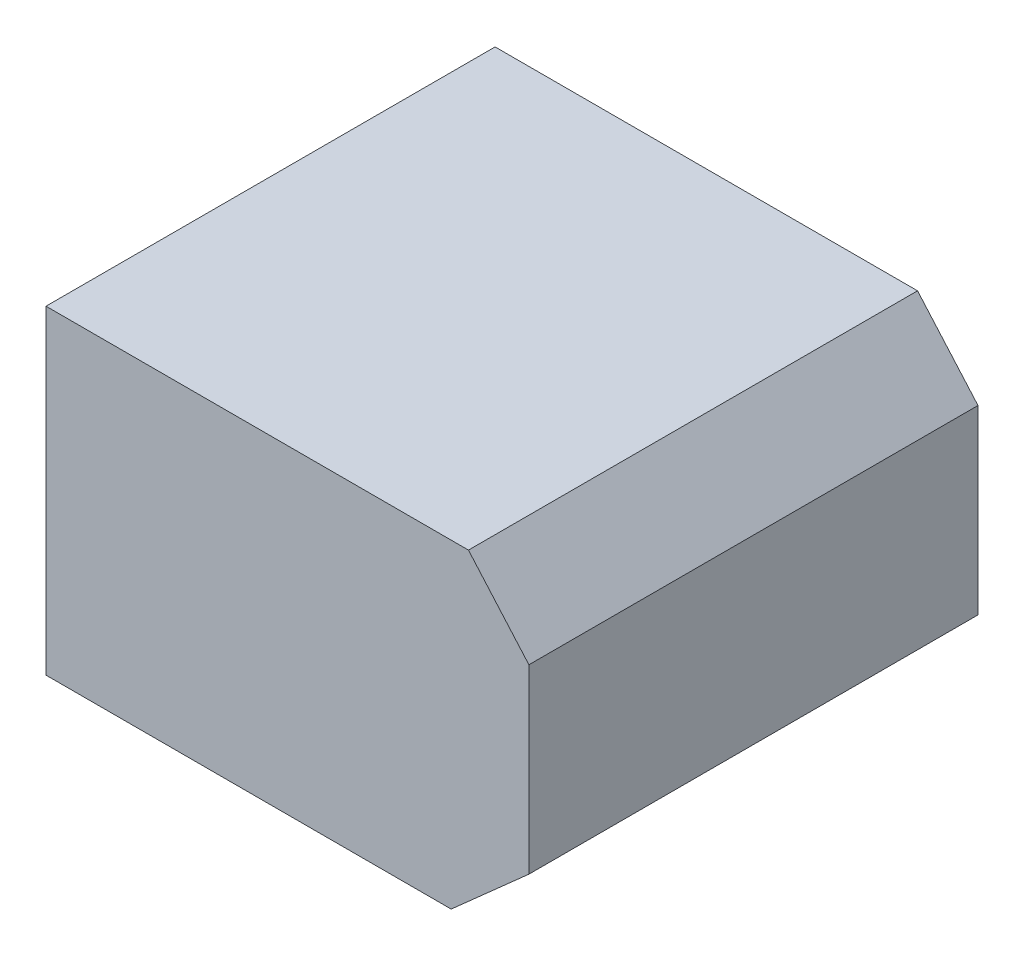
ISO-10303-21;
HEADER;
FILE_DESCRIPTION(('STEP AP214'),'2;1');
FILE_NAME('part.step','',(''),(''),'','','');
FILE_SCHEMA(('AUTOMOTIVE_DESIGN { 1 0 10303 214 1 1 1 1 }'));
ENDSEC;
DATA;
#1=APPLICATION_CONTEXT('core data for automotive mechanical design processes');
#2=APPLICATION_PROTOCOL_DEFINITION('international standard','automotive_design',2000,#1);
#3=PRODUCT_CONTEXT('',#1,'mechanical');
#4=PRODUCT('Part','Part','',(#3));
#5=PRODUCT_RELATED_PRODUCT_CATEGORY('part','',(#4));
#6=PRODUCT_DEFINITION_FORMATION('','',#4);
#7=PRODUCT_DEFINITION_CONTEXT('part definition',#1,'design');
#8=PRODUCT_DEFINITION('design','',#6,#7);
#9=PRODUCT_DEFINITION_SHAPE('','',#8);
#10=(LENGTH_UNIT() NAMED_UNIT(*) SI_UNIT(.MILLI.,.METRE.));
#11=(NAMED_UNIT(*) PLANE_ANGLE_UNIT() SI_UNIT($,.RADIAN.));
#12=(NAMED_UNIT(*) SI_UNIT($,.STERADIAN.) SOLID_ANGLE_UNIT());
#13=UNCERTAINTY_MEASURE_WITH_UNIT(LENGTH_MEASURE(1.E-05),#10,'distance_accuracy_value','');
#14=(GEOMETRIC_REPRESENTATION_CONTEXT(3) GLOBAL_UNCERTAINTY_ASSIGNED_CONTEXT((#13)) GLOBAL_UNIT_ASSIGNED_CONTEXT((#10,
#11,#12)) REPRESENTATION_CONTEXT('',''));
#15=CARTESIAN_POINT('',(0.,0.,0.));
#16=DIRECTION('',(0.,0.,1.));
#17=DIRECTION('',(1.,0.,0.));
#18=AXIS2_PLACEMENT_3D('',#15,#16,#17);
#19=CARTESIAN_POINT('',(-0.915165952785248,-37.,52.));
#20=DIRECTION('',(1.,0.,0.));
#21=DIRECTION('',(0.,0.,-1.));
#22=AXIS2_PLACEMENT_3D('',#19,#20,#21);
#23=PLANE('',#22);
#24=DIRECTION('',(0.,-1.,0.));
#25=VECTOR('',#24,1.);
#26=CARTESIAN_POINT('',(-0.915165952785248,-37.,0.));
#27=LINE('',#26,#25);
#28=CARTESIAN_POINT('',(-0.915165952785248,0.,0.));
#29=VERTEX_POINT('',#28);
#30=CARTESIAN_POINT('',(-0.915165952785248,-37.,0.));
#31=VERTEX_POINT('',#30);
#32=EDGE_CURVE('E135',#29,#31,#27,.T.);
#33=ORIENTED_EDGE('',*,*,#32,.T.);
#34=DIRECTION('',(0.,0.,-1.));
#35=VECTOR('',#34,1.);
#36=CARTESIAN_POINT('',(-0.915165952785248,-37.,52.));
#37=LINE('',#36,#35);
#38=CARTESIAN_POINT('',(-0.915165952785248,-37.,52.));
#39=VERTEX_POINT('',#38);
#40=EDGE_CURVE('E11',#39,#31,#37,.T.);
#41=ORIENTED_EDGE('',*,*,#40,.F.);
#42=DIRECTION('',(0.,-1.,0.));
#43=VECTOR('',#42,1.);
#44=CARTESIAN_POINT('',(-0.915165952785248,-37.,52.));
#45=LINE('',#44,#43);
#46=CARTESIAN_POINT('',(-0.915165952785248,0.,52.));
#47=VERTEX_POINT('',#46);
#48=EDGE_CURVE('E147',#47,#39,#45,.T.);
#49=ORIENTED_EDGE('',*,*,#48,.F.);
#50=DIRECTION('',(0.,0.,-1.));
#51=VECTOR('',#50,1.);
#52=CARTESIAN_POINT('',(-0.915165952785248,0.,52.));
#53=LINE('',#52,#51);
#54=EDGE_CURVE('E131',#47,#29,#53,.T.);
#55=ORIENTED_EDGE('',*,*,#54,.T.);
#56=EDGE_LOOP('',(#33,#41,#49,#55));
#57=FACE_BOUND('',#56,.T.);
#58=DIRECTION('',(0.,-1.,0.));
#59=VECTOR('',#58,1.);
#60=CARTESIAN_POINT('',(-0.915165952785248,0.,5.));
#61=LINE('',#60,#59);
#62=CARTESIAN_POINT('',(-0.915165952785248,-5.,5.));
#63=VERTEX_POINT('',#62);
#64=CARTESIAN_POINT('',(-0.915165952785248,-32.,5.));
#65=VERTEX_POINT('',#64);
#66=EDGE_CURVE('E165',#63,#65,#61,.T.);
#67=ORIENTED_EDGE('',*,*,#66,.F.);
#68=DIRECTION('',(0.,0.,-1.));
#69=VECTOR('',#68,1.);
#70=CARTESIAN_POINT('',(-0.915165952785248,-5.,52.));
#71=LINE('',#70,#69);
#72=CARTESIAN_POINT('',(-0.915165952785248,-5.,47.));
#73=VERTEX_POINT('',#72);
#74=EDGE_CURVE('E169',#73,#63,#71,.T.);
#75=ORIENTED_EDGE('',*,*,#74,.F.);
#76=DIRECTION('',(0.,-1.,0.));
#77=VECTOR('',#76,1.);
#78=CARTESIAN_POINT('',(-0.915165952785248,0.,47.));
#79=LINE('',#78,#77);
#80=CARTESIAN_POINT('',(-0.915165952785248,-32.,47.));
#81=VERTEX_POINT('',#80);
#82=EDGE_CURVE('E53',#73,#81,#79,.T.);
#83=ORIENTED_EDGE('',*,*,#82,.T.);
#84=DIRECTION('',(0.,0.,-1.));
#85=VECTOR('',#84,1.);
#86=CARTESIAN_POINT('',(-0.915165952785249,-32.,52.));
#87=LINE('',#86,#85);
#88=EDGE_CURVE('E139',#81,#65,#87,.T.);
#89=ORIENTED_EDGE('',*,*,#88,.T.);
#90=EDGE_LOOP('',(#67,#75,#83,#89));
#91=FACE_BOUND('',#90,.T.);
#92=ADVANCED_FACE('F39',(#57,#91),#23,.F.);
#93=CARTESIAN_POINT('',(46.,-37.,52.));
#94=DIRECTION('',(0.,1.,0.));
#95=DIRECTION('',(0.,0.,1.));
#96=AXIS2_PLACEMENT_3D('',#93,#94,#95);
#97=PLANE('',#96);
#98=DIRECTION('',(1.,0.,0.));
#99=VECTOR('',#98,1.);
#100=CARTESIAN_POINT('',(46.,-37.,0.));
#101=LINE('',#100,#99);
#102=CARTESIAN_POINT('',(46.,-37.,0.));
#103=VERTEX_POINT('',#102);
#104=EDGE_CURVE('E138',#31,#103,#101,.T.);
#105=ORIENTED_EDGE('',*,*,#104,.T.);
#106=DIRECTION('',(0.,0.,-1.));
#107=VECTOR('',#106,1.);
#108=CARTESIAN_POINT('',(46.,-37.,52.));
#109=LINE('',#108,#107);
#110=CARTESIAN_POINT('',(46.,-37.,52.));
#111=VERTEX_POINT('',#110);
#112=EDGE_CURVE('E46',#111,#103,#109,.T.);
#113=ORIENTED_EDGE('',*,*,#112,.F.);
#114=DIRECTION('',(1.,0.,0.));
#115=VECTOR('',#114,1.);
#116=CARTESIAN_POINT('',(46.,-37.,52.));
#117=LINE('',#116,#115);
#118=EDGE_CURVE('E97',#39,#111,#117,.T.);
#119=ORIENTED_EDGE('',*,*,#118,.F.);
#120=ORIENTED_EDGE('',*,*,#40,.T.);
#121=EDGE_LOOP('',(#105,#113,#119,#120));
#122=FACE_BOUND('',#121,.T.);
#123=ADVANCED_FACE('F256',(#122),#97,.F.);
#124=CARTESIAN_POINT('',(55.,-29.,52.));
#125=DIRECTION('',(-0.66436383882992,0.74740931868366,0.));
#126=DIRECTION('',(-0.74740931868366,-0.66436383882992,0.));
#127=AXIS2_PLACEMENT_3D('',#124,#125,#126);
#128=PLANE('',#127);
#129=DIRECTION('',(0.74740931868366,0.66436383882992,0.));
#130=VECTOR('',#129,1.);
#131=CARTESIAN_POINT('',(55.,-29.,0.));
#132=LINE('',#131,#130);
#133=CARTESIAN_POINT('',(55.,-29.,0.));
#134=VERTEX_POINT('',#133);
#135=EDGE_CURVE('E141',#103,#134,#132,.T.);
#136=ORIENTED_EDGE('',*,*,#135,.T.);
#137=DIRECTION('',(0.,0.,-1.));
#138=VECTOR('',#137,1.);
#139=CARTESIAN_POINT('',(55.,-29.,52.));
#140=LINE('',#139,#138);
#141=CARTESIAN_POINT('',(55.,-29.,52.));
#142=VERTEX_POINT('',#141);
#143=EDGE_CURVE('E126',#142,#134,#140,.T.);
#144=ORIENTED_EDGE('',*,*,#143,.F.);
#145=DIRECTION('',(0.74740931868366,0.66436383882992,0.));
#146=VECTOR('',#145,1.);
#147=CARTESIAN_POINT('',(55.,-29.,52.));
#148=LINE('',#147,#146);
#149=EDGE_CURVE('E114',#111,#142,#148,.T.);
#150=ORIENTED_EDGE('',*,*,#149,.F.);
#151=ORIENTED_EDGE('',*,*,#112,.T.);
#152=EDGE_LOOP('',(#136,#144,#150,#151));
#153=FACE_BOUND('',#152,.T.);
#154=ADVANCED_FACE('F153',(#153),#128,.F.);
#155=CARTESIAN_POINT('',(55.,-8.,52.));
#156=DIRECTION('',(-1.,0.,0.));
#157=DIRECTION('',(0.,0.,1.));
#158=AXIS2_PLACEMENT_3D('',#155,#156,#157);
#159=PLANE('',#158);
#160=DIRECTION('',(0.,1.,0.));
#161=VECTOR('',#160,1.);
#162=CARTESIAN_POINT('',(55.,-8.,0.));
#163=LINE('',#162,#161);
#164=CARTESIAN_POINT('',(55.,-8.,0.));
#165=VERTEX_POINT('',#164);
#166=EDGE_CURVE('E123',#134,#165,#163,.T.);
#167=ORIENTED_EDGE('',*,*,#166,.T.);
#168=DIRECTION('',(0.,0.,-1.));
#169=VECTOR('',#168,1.);
#170=CARTESIAN_POINT('',(55.,-8.,52.));
#171=LINE('',#170,#169);
#172=CARTESIAN_POINT('',(55.,-8.,52.));
#173=VERTEX_POINT('',#172);
#174=EDGE_CURVE('E120',#173,#165,#171,.T.);
#175=ORIENTED_EDGE('',*,*,#174,.F.);
#176=DIRECTION('',(0.,1.,0.));
#177=VECTOR('',#176,1.);
#178=CARTESIAN_POINT('',(55.,-8.,52.));
#179=LINE('',#178,#177);
#180=EDGE_CURVE('E107',#142,#173,#179,.T.);
#181=ORIENTED_EDGE('',*,*,#180,.F.);
#182=ORIENTED_EDGE('',*,*,#143,.T.);
#183=EDGE_LOOP('',(#167,#175,#181,#182));
#184=FACE_BOUND('',#183,.T.);
#185=ADVANCED_FACE('F121',(#184),#159,.F.);
#186=CARTESIAN_POINT('',(48.,0.,52.));
#187=DIRECTION('',(-0.752576694706878,-0.658504607868518,0.));
#188=DIRECTION('',(0.658504607868518,-0.752576694706878,0.));
#189=AXIS2_PLACEMENT_3D('',#186,#187,#188);
#190=PLANE('',#189);
#191=DIRECTION('',(-0.658504607868518,0.752576694706878,0.));
#192=VECTOR('',#191,1.);
#193=CARTESIAN_POINT('',(48.,0.,0.));
#194=LINE('',#193,#192);
#195=CARTESIAN_POINT('',(48.,0.,0.));
#196=VERTEX_POINT('',#195);
#197=EDGE_CURVE('E144',#165,#196,#194,.T.);
#198=ORIENTED_EDGE('',*,*,#197,.T.);
#199=DIRECTION('',(0.,0.,-1.));
#200=VECTOR('',#199,1.);
#201=CARTESIAN_POINT('',(48.,0.,52.));
#202=LINE('',#201,#200);
#203=CARTESIAN_POINT('',(48.,0.,52.));
#204=VERTEX_POINT('',#203);
#205=EDGE_CURVE('E127',#204,#196,#202,.T.);
#206=ORIENTED_EDGE('',*,*,#205,.F.);
#207=DIRECTION('',(-0.658504607868518,0.752576694706878,0.));
#208=VECTOR('',#207,1.);
#209=CARTESIAN_POINT('',(48.,0.,52.));
#210=LINE('',#209,#208);
#211=EDGE_CURVE('E111',#173,#204,#210,.T.);
#212=ORIENTED_EDGE('',*,*,#211,.F.);
#213=ORIENTED_EDGE('',*,*,#174,.T.);
#214=EDGE_LOOP('',(#198,#206,#212,#213));
#215=FACE_BOUND('',#214,.T.);
#216=ADVANCED_FACE('F129',(#215),#190,.F.);
#217=CARTESIAN_POINT('',(-0.915165952785248,0.,52.));
#218=DIRECTION('',(0.,-1.,0.));
#219=DIRECTION('',(0.,0.,-1.));
#220=AXIS2_PLACEMENT_3D('',#217,#218,#219);
#221=PLANE('',#220);
#222=DIRECTION('',(-1.,0.,0.));
#223=VECTOR('',#222,1.);
#224=CARTESIAN_POINT('',(-0.915165952785248,0.,0.));
#225=LINE('',#224,#223);
#226=EDGE_CURVE('E89',#196,#29,#225,.T.);
#227=ORIENTED_EDGE('',*,*,#226,.T.);
#228=ORIENTED_EDGE('',*,*,#54,.F.);
#229=DIRECTION('',(-1.,0.,0.));
#230=VECTOR('',#229,1.);
#231=CARTESIAN_POINT('',(-0.915165952785248,0.,52.));
#232=LINE('',#231,#230);
#233=EDGE_CURVE('E62',#204,#47,#232,.T.);
#234=ORIENTED_EDGE('',*,*,#233,.F.);
#235=ORIENTED_EDGE('',*,*,#205,.T.);
#236=EDGE_LOOP('',(#227,#228,#234,#235));
#237=FACE_BOUND('',#236,.T.);
#238=ADVANCED_FACE('F157',(#237),#221,.F.);
#239=CARTESIAN_POINT('',(0.,0.,52.));
#240=DIRECTION('',(0.,0.,-1.));
#241=DIRECTION('',(-1.,0.,0.));
#242=AXIS2_PLACEMENT_3D('',#239,#240,#241);
#243=PLANE('',#242);
#244=ORIENTED_EDGE('',*,*,#48,.T.);
#245=ORIENTED_EDGE('',*,*,#118,.T.);
#246=ORIENTED_EDGE('',*,*,#149,.T.);
#247=ORIENTED_EDGE('',*,*,#180,.T.);
#248=ORIENTED_EDGE('',*,*,#211,.T.);
#249=ORIENTED_EDGE('',*,*,#233,.T.);
#250=EDGE_LOOP('',(#244,#245,#246,#247,#248,#249));
#251=FACE_BOUND('',#250,.T.);
#252=ADVANCED_FACE('F109',(#251),#243,.F.);
#253=CARTESIAN_POINT('',(0.,0.,0.));
#254=DIRECTION('',(0.,0.,-1.));
#255=DIRECTION('',(-1.,0.,0.));
#256=AXIS2_PLACEMENT_3D('',#253,#254,#255);
#257=PLANE('',#256);
#258=ORIENTED_EDGE('',*,*,#32,.F.);
#259=ORIENTED_EDGE('',*,*,#226,.F.);
#260=ORIENTED_EDGE('',*,*,#197,.F.);
#261=ORIENTED_EDGE('',*,*,#166,.F.);
#262=ORIENTED_EDGE('',*,*,#135,.F.);
#263=ORIENTED_EDGE('',*,*,#104,.F.);
#264=EDGE_LOOP('',(#258,#259,#260,#261,#262,#263));
#265=FACE_BOUND('',#264,.T.);
#266=ADVANCED_FACE('F156',(#265),#257,.T.);
#267=CARTESIAN_POINT('',(46.,-32.,52.));
#268=DIRECTION('',(0.,1.,0.));
#269=DIRECTION('',(0.,0.,1.));
#270=AXIS2_PLACEMENT_3D('',#267,#268,#269);
#271=PLANE('',#270);
#272=DIRECTION('',(1.,0.,0.));
#273=VECTOR('',#272,1.);
#274=CARTESIAN_POINT('',(0.,-32.,5.));
#275=LINE('',#274,#273);
#276=CARTESIAN_POINT('',(44.0990033882548,-32.,5.));
#277=VERTEX_POINT('',#276);
#278=EDGE_CURVE('E168',#65,#277,#275,.T.);
#279=ORIENTED_EDGE('',*,*,#278,.F.);
#280=ORIENTED_EDGE('',*,*,#88,.F.);
#281=DIRECTION('',(1.,0.,0.));
#282=VECTOR('',#281,1.);
#283=CARTESIAN_POINT('',(0.,-32.,47.));
#284=LINE('',#283,#282);
#285=CARTESIAN_POINT('',(44.0990033882548,-32.,47.));
#286=VERTEX_POINT('',#285);
#287=EDGE_CURVE('E175',#81,#286,#284,.T.);
#288=ORIENTED_EDGE('',*,*,#287,.T.);
#289=DIRECTION('',(0.,0.,-1.));
#290=VECTOR('',#289,1.);
#291=CARTESIAN_POINT('',(44.0990033882548,-32.,52.));
#292=LINE('',#291,#290);
#293=EDGE_CURVE('E179',#286,#277,#292,.T.);
#294=ORIENTED_EDGE('',*,*,#293,.T.);
#295=EDGE_LOOP('',(#279,#280,#288,#294));
#296=FACE_BOUND('',#295,.T.);
#297=ADVANCED_FACE('F225',(#296),#271,.T.);
#298=CARTESIAN_POINT('',(51.6781808058504,-25.2629534065817,52.));
#299=DIRECTION('',(-0.66436383882992,0.74740931868366,0.));
#300=DIRECTION('',(-0.74740931868366,-0.66436383882992,0.));
#301=AXIS2_PLACEMENT_3D('',#298,#299,#300);
#302=PLANE('',#301);
#303=DIRECTION('',(0.74740931868366,0.66436383882992,0.));
#304=VECTOR('',#303,1.);
#305=CARTESIAN_POINT('',(35.3540428748159,-39.7732982341679,5.));
#306=LINE('',#305,#304);
#307=CARTESIAN_POINT('',(50.,-26.7546696784487,5.));
#308=VERTEX_POINT('',#307);
#309=EDGE_CURVE('E202',#277,#308,#306,.T.);
#310=ORIENTED_EDGE('',*,*,#309,.F.);
#311=ORIENTED_EDGE('',*,*,#293,.F.);
#312=DIRECTION('',(0.74740931868366,0.66436383882992,0.));
#313=VECTOR('',#312,1.);
#314=CARTESIAN_POINT('',(35.3540428748159,-39.7732982341679,47.));
#315=LINE('',#314,#313);
#316=CARTESIAN_POINT('',(50.,-26.7546696784487,47.));
#317=VERTEX_POINT('',#316);
#318=EDGE_CURVE('E196',#286,#317,#315,.T.);
#319=ORIENTED_EDGE('',*,*,#318,.T.);
#320=DIRECTION('',(0.,0.,-1.));
#321=VECTOR('',#320,1.);
#322=CARTESIAN_POINT('',(50.,-26.7546696784487,52.));
#323=LINE('',#322,#321);
#324=EDGE_CURVE('E199',#317,#308,#323,.T.);
#325=ORIENTED_EDGE('',*,*,#324,.T.);
#326=EDGE_LOOP('',(#310,#311,#319,#325));
#327=FACE_BOUND('',#326,.T.);
#328=ADVANCED_FACE('F229',(#327),#302,.T.);
#329=CARTESIAN_POINT('',(50.,-8.,52.));
#330=DIRECTION('',(-1.,0.,0.));
#331=DIRECTION('',(0.,0.,1.));
#332=AXIS2_PLACEMENT_3D('',#329,#330,#331);
#333=PLANE('',#332);
#334=DIRECTION('',(0.,1.,0.));
#335=VECTOR('',#334,1.);
#336=CARTESIAN_POINT('',(50.,0.,5.));
#337=LINE('',#336,#335);
#338=CARTESIAN_POINT('',(50.,-9.87867558052475,5.));
#339=VERTEX_POINT('',#338);
#340=EDGE_CURVE('E193',#308,#339,#337,.T.);
#341=ORIENTED_EDGE('',*,*,#340,.F.);
#342=ORIENTED_EDGE('',*,*,#324,.F.);
#343=DIRECTION('',(0.,1.,0.));
#344=VECTOR('',#343,1.);
#345=CARTESIAN_POINT('',(50.,0.,47.));
#346=LINE('',#345,#344);
#347=CARTESIAN_POINT('',(50.,-9.87867558052475,47.));
#348=VERTEX_POINT('',#347);
#349=EDGE_CURVE('E187',#317,#348,#346,.T.);
#350=ORIENTED_EDGE('',*,*,#349,.T.);
#351=DIRECTION('',(0.,0.,-1.));
#352=VECTOR('',#351,1.);
#353=CARTESIAN_POINT('',(50.,-9.87867558052475,52.));
#354=LINE('',#353,#352);
#355=EDGE_CURVE('E190',#348,#339,#354,.T.);
#356=ORIENTED_EDGE('',*,*,#355,.T.);
#357=EDGE_LOOP('',(#341,#342,#350,#356));
#358=FACE_BOUND('',#357,.T.);
#359=ADVANCED_FACE('F237',(#358),#333,.T.);
#360=CARTESIAN_POINT('',(44.2371165264656,-3.29252303934259,52.));
#361=DIRECTION('',(-0.752576694706878,-0.658504607868518,0.));
#362=DIRECTION('',(0.658504607868518,-0.752576694706878,0.));
#363=AXIS2_PLACEMENT_3D('',#360,#361,#362);
#364=PLANE('',#363);
#365=DIRECTION('',(-0.658504607868518,0.752576694706878,0.));
#366=VECTOR('',#365,1.);
#367=CARTESIAN_POINT('',(23.4229572344302,20.4950875801264,5.));
#368=LINE('',#367,#366);
#369=CARTESIAN_POINT('',(45.7311588670408,-5.,5.));
#370=VERTEX_POINT('',#369);
#371=EDGE_CURVE('E184',#339,#370,#368,.T.);
#372=ORIENTED_EDGE('',*,*,#371,.F.);
#373=ORIENTED_EDGE('',*,*,#355,.F.);
#374=DIRECTION('',(-0.658504607868518,0.752576694706878,0.));
#375=VECTOR('',#374,1.);
#376=CARTESIAN_POINT('',(23.4229572344302,20.4950875801264,47.));
#377=LINE('',#376,#375);
#378=CARTESIAN_POINT('',(45.7311588670408,-5.,47.));
#379=VERTEX_POINT('',#378);
#380=EDGE_CURVE('E181',#348,#379,#377,.T.);
#381=ORIENTED_EDGE('',*,*,#380,.T.);
#382=DIRECTION('',(0.,0.,-1.));
#383=VECTOR('',#382,1.);
#384=CARTESIAN_POINT('',(45.7311588670408,-5.,52.));
#385=LINE('',#384,#383);
#386=EDGE_CURVE('E172',#379,#370,#385,.T.);
#387=ORIENTED_EDGE('',*,*,#386,.T.);
#388=EDGE_LOOP('',(#372,#373,#381,#387));
#389=FACE_BOUND('',#388,.T.);
#390=ADVANCED_FACE('F282',(#389),#364,.T.);
#391=CARTESIAN_POINT('',(-0.915165952785248,-5.,52.));
#392=DIRECTION('',(0.,-1.,0.));
#393=DIRECTION('',(0.,0.,-1.));
#394=AXIS2_PLACEMENT_3D('',#391,#392,#393);
#395=PLANE('',#394);
#396=DIRECTION('',(-1.,0.,0.));
#397=VECTOR('',#396,1.);
#398=CARTESIAN_POINT('',(0.,-5.,5.));
#399=LINE('',#398,#397);
#400=EDGE_CURVE('E176',#370,#63,#399,.T.);
#401=ORIENTED_EDGE('',*,*,#400,.F.);
#402=ORIENTED_EDGE('',*,*,#386,.F.);
#403=DIRECTION('',(-1.,0.,0.));
#404=VECTOR('',#403,1.);
#405=CARTESIAN_POINT('',(0.,-5.,47.));
#406=LINE('',#405,#404);
#407=EDGE_CURVE('E173',#379,#73,#406,.T.);
#408=ORIENTED_EDGE('',*,*,#407,.T.);
#409=ORIENTED_EDGE('',*,*,#74,.T.);
#410=EDGE_LOOP('',(#401,#402,#408,#409));
#411=FACE_BOUND('',#410,.T.);
#412=ADVANCED_FACE('F254',(#411),#395,.T.);
#413=CARTESIAN_POINT('',(0.,0.,47.));
#414=DIRECTION('',(0.,0.,-1.));
#415=DIRECTION('',(-1.,0.,0.));
#416=AXIS2_PLACEMENT_3D('',#413,#414,#415);
#417=PLANE('',#416);
#418=ORIENTED_EDGE('',*,*,#82,.F.);
#419=ORIENTED_EDGE('',*,*,#407,.F.);
#420=ORIENTED_EDGE('',*,*,#380,.F.);
#421=ORIENTED_EDGE('',*,*,#349,.F.);
#422=ORIENTED_EDGE('',*,*,#318,.F.);
#423=ORIENTED_EDGE('',*,*,#287,.F.);
#424=EDGE_LOOP('',(#418,#419,#420,#421,#422,#423));
#425=FACE_BOUND('',#424,.T.);
#426=ADVANCED_FACE('F277',(#425),#417,.T.);
#427=CARTESIAN_POINT('',(0.,0.,5.));
#428=DIRECTION('',(0.,0.,-1.));
#429=DIRECTION('',(-1.,0.,0.));
#430=AXIS2_PLACEMENT_3D('',#427,#428,#429);
#431=PLANE('',#430);
#432=ORIENTED_EDGE('',*,*,#66,.T.);
#433=ORIENTED_EDGE('',*,*,#278,.T.);
#434=ORIENTED_EDGE('',*,*,#309,.T.);
#435=ORIENTED_EDGE('',*,*,#340,.T.);
#436=ORIENTED_EDGE('',*,*,#371,.T.);
#437=ORIENTED_EDGE('',*,*,#400,.T.);
#438=EDGE_LOOP('',(#432,#433,#434,#435,#436,#437));
#439=FACE_BOUND('',#438,.T.);
#440=ADVANCED_FACE('F217',(#439),#431,.F.);
#441=CLOSED_SHELL('',(#92,#123,#154,#185,#216,#238,#252,#266,#297,#328,#359,#390,#412,#426,#440));
#442=MANIFOLD_SOLID_BREP('B2',#441);
#443=ADVANCED_BREP_SHAPE_REPRESENTATION('',(#18,#442),#14);
#444=SHAPE_DEFINITION_REPRESENTATION(#9,#443);
ENDSEC;
END-ISO-10303-21;
